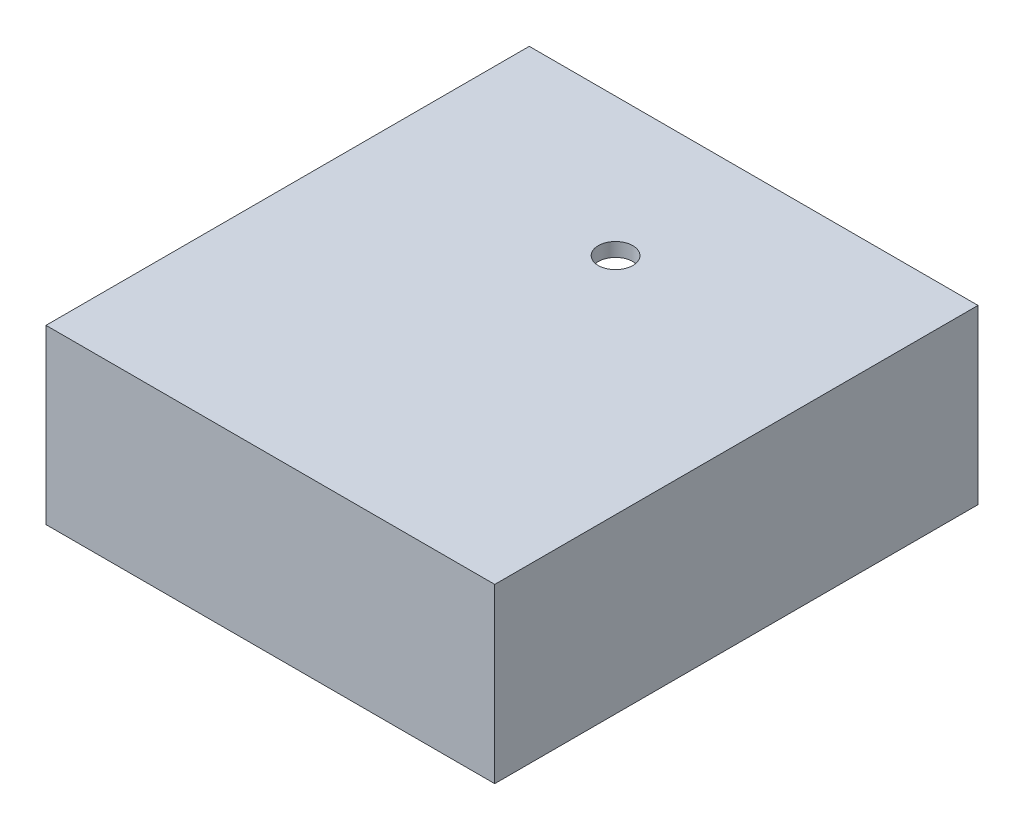
ISO-10303-21;
HEADER;
FILE_DESCRIPTION(('STEP AP214'),'2;1');
FILE_NAME('part.step','',(''),(''),'','','');
FILE_SCHEMA(('AUTOMOTIVE_DESIGN { 1 0 10303 214 1 1 1 1 }'));
ENDSEC;
DATA;
#1=APPLICATION_CONTEXT('core data for automotive mechanical design processes');
#2=APPLICATION_PROTOCOL_DEFINITION('international standard','automotive_design',2000,#1);
#3=PRODUCT_CONTEXT('',#1,'mechanical');
#4=PRODUCT('Part','Part','',(#3));
#5=PRODUCT_RELATED_PRODUCT_CATEGORY('part','',(#4));
#6=PRODUCT_DEFINITION_FORMATION('','',#4);
#7=PRODUCT_DEFINITION_CONTEXT('part definition',#1,'design');
#8=PRODUCT_DEFINITION('design','',#6,#7);
#9=PRODUCT_DEFINITION_SHAPE('','',#8);
#10=(LENGTH_UNIT() NAMED_UNIT(*) SI_UNIT(.MILLI.,.METRE.));
#11=(NAMED_UNIT(*) PLANE_ANGLE_UNIT() SI_UNIT($,.RADIAN.));
#12=(NAMED_UNIT(*) SI_UNIT($,.STERADIAN.) SOLID_ANGLE_UNIT());
#13=UNCERTAINTY_MEASURE_WITH_UNIT(LENGTH_MEASURE(1.E-05),#10,'distance_accuracy_value','');
#14=(GEOMETRIC_REPRESENTATION_CONTEXT(3) GLOBAL_UNCERTAINTY_ASSIGNED_CONTEXT((#13)) GLOBAL_UNIT_ASSIGNED_CONTEXT((#10,
#11,#12)) REPRESENTATION_CONTEXT('',''));
#15=CARTESIAN_POINT('',(0.,0.,0.));
#16=DIRECTION('',(0.,0.,1.));
#17=DIRECTION('',(1.,0.,0.));
#18=AXIS2_PLACEMENT_3D('',#15,#16,#17);
#19=CARTESIAN_POINT('',(0.,25.,0.));
#20=DIRECTION('',(1.,0.,0.));
#21=DIRECTION('',(0.,0.,-1.));
#22=AXIS2_PLACEMENT_3D('',#19,#20,#21);
#23=PLANE('',#22);
#24=DIRECTION('',(0.,0.,1.));
#25=VECTOR('',#24,1.);
#26=CARTESIAN_POINT('',(0.,0.,0.));
#27=LINE('',#26,#25);
#28=CARTESIAN_POINT('',(0.,0.,0.));
#29=VERTEX_POINT('',#28);
#30=CARTESIAN_POINT('',(0.,0.,70.));
#31=VERTEX_POINT('',#30);
#32=EDGE_CURVE('E144',#29,#31,#27,.T.);
#33=ORIENTED_EDGE('',*,*,#32,.T.);
#34=DIRECTION('',(0.,-1.,0.));
#35=VECTOR('',#34,1.);
#36=CARTESIAN_POINT('',(0.,25.,70.));
#37=LINE('',#36,#35);
#38=CARTESIAN_POINT('',(0.,25.,70.));
#39=VERTEX_POINT('',#38);
#40=EDGE_CURVE('E11',#39,#31,#37,.T.);
#41=ORIENTED_EDGE('',*,*,#40,.F.);
#42=DIRECTION('',(0.,0.,1.));
#43=VECTOR('',#42,1.);
#44=CARTESIAN_POINT('',(0.,25.,0.));
#45=LINE('',#44,#43);
#46=CARTESIAN_POINT('',(0.,25.,0.));
#47=VERTEX_POINT('',#46);
#48=EDGE_CURVE('E148',#47,#39,#45,.T.);
#49=ORIENTED_EDGE('',*,*,#48,.F.);
#50=DIRECTION('',(0.,-1.,0.));
#51=VECTOR('',#50,1.);
#52=CARTESIAN_POINT('',(0.,25.,0.));
#53=LINE('',#52,#51);
#54=EDGE_CURVE('E154',#47,#29,#53,.T.);
#55=ORIENTED_EDGE('',*,*,#54,.T.);
#56=EDGE_LOOP('',(#33,#41,#49,#55));
#57=FACE_BOUND('',#56,.T.);
#58=ADVANCED_FACE('F32',(#57),#23,.F.);
#59=CARTESIAN_POINT('',(0.,25.,70.));
#60=DIRECTION('',(0.,0.,-1.));
#61=DIRECTION('',(-1.,0.,0.));
#62=AXIS2_PLACEMENT_3D('',#59,#60,#61);
#63=PLANE('',#62);
#64=DIRECTION('',(1.,0.,0.));
#65=VECTOR('',#64,1.);
#66=CARTESIAN_POINT('',(0.,0.,70.));
#67=LINE('',#66,#65);
#68=CARTESIAN_POINT('',(65.,0.,70.));
#69=VERTEX_POINT('',#68);
#70=EDGE_CURVE('E157',#31,#69,#67,.T.);
#71=ORIENTED_EDGE('',*,*,#70,.T.);
#72=DIRECTION('',(0.,-1.,0.));
#73=VECTOR('',#72,1.);
#74=CARTESIAN_POINT('',(65.,25.,70.));
#75=LINE('',#74,#73);
#76=CARTESIAN_POINT('',(65.,25.,70.));
#77=VERTEX_POINT('',#76);
#78=EDGE_CURVE('E40',#77,#69,#75,.T.);
#79=ORIENTED_EDGE('',*,*,#78,.F.);
#80=DIRECTION('',(1.,0.,0.));
#81=VECTOR('',#80,1.);
#82=CARTESIAN_POINT('',(0.,25.,70.));
#83=LINE('',#82,#81);
#84=EDGE_CURVE('E84',#39,#77,#83,.T.);
#85=ORIENTED_EDGE('',*,*,#84,.F.);
#86=ORIENTED_EDGE('',*,*,#40,.T.);
#87=EDGE_LOOP('',(#71,#79,#85,#86));
#88=FACE_BOUND('',#87,.T.);
#89=ADVANCED_FACE('F188',(#88),#63,.F.);
#90=CARTESIAN_POINT('',(65.,25.,0.));
#91=DIRECTION('',(-1.,0.,0.));
#92=DIRECTION('',(0.,0.,1.));
#93=AXIS2_PLACEMENT_3D('',#90,#91,#92);
#94=PLANE('',#93);
#95=DIRECTION('',(0.,0.,-1.));
#96=VECTOR('',#95,1.);
#97=CARTESIAN_POINT('',(65.,0.,0.));
#98=LINE('',#97,#96);
#99=CARTESIAN_POINT('',(65.,0.,0.));
#100=VERTEX_POINT('',#99);
#101=EDGE_CURVE('E159',#69,#100,#98,.T.);
#102=ORIENTED_EDGE('',*,*,#101,.T.);
#103=DIRECTION('',(0.,-1.,0.));
#104=VECTOR('',#103,1.);
#105=CARTESIAN_POINT('',(65.,25.,0.));
#106=LINE('',#105,#104);
#107=CARTESIAN_POINT('',(65.,25.,0.));
#108=VERTEX_POINT('',#107);
#109=EDGE_CURVE('E163',#108,#100,#106,.T.);
#110=ORIENTED_EDGE('',*,*,#109,.F.);
#111=DIRECTION('',(0.,0.,-1.));
#112=VECTOR('',#111,1.);
#113=CARTESIAN_POINT('',(65.,25.,0.));
#114=LINE('',#113,#112);
#115=EDGE_CURVE('E151',#77,#108,#114,.T.);
#116=ORIENTED_EDGE('',*,*,#115,.F.);
#117=ORIENTED_EDGE('',*,*,#78,.T.);
#118=EDGE_LOOP('',(#102,#110,#116,#117));
#119=FACE_BOUND('',#118,.T.);
#120=ADVANCED_FACE('F169',(#119),#94,.F.);
#121=CARTESIAN_POINT('',(0.,25.,0.));
#122=DIRECTION('',(0.,0.,1.));
#123=DIRECTION('',(1.,0.,0.));
#124=AXIS2_PLACEMENT_3D('',#121,#122,#123);
#125=PLANE('',#124);
#126=DIRECTION('',(1.,0.,0.));
#127=VECTOR('',#126,1.);
#128=CARTESIAN_POINT('',(63.,23.,0.));
#129=LINE('',#128,#127);
#130=CARTESIAN_POINT('',(1.99999999999999,23.,0.));
#131=VERTEX_POINT('',#130);
#132=CARTESIAN_POINT('',(63.,23.,0.));
#133=VERTEX_POINT('',#132);
#134=EDGE_CURVE('E138',#131,#133,#129,.T.);
#135=ORIENTED_EDGE('',*,*,#134,.F.);
#136=DIRECTION('',(0.,1.,0.));
#137=VECTOR('',#136,1.);
#138=CARTESIAN_POINT('',(1.99999999999999,1.99999999999999,0.));
#139=LINE('',#138,#137);
#140=CARTESIAN_POINT('',(1.99999999999999,1.99999999999999,0.));
#141=VERTEX_POINT('',#140);
#142=EDGE_CURVE('E47',#141,#131,#139,.T.);
#143=ORIENTED_EDGE('',*,*,#142,.F.);
#144=DIRECTION('',(-1.,0.,0.));
#145=VECTOR('',#144,1.);
#146=CARTESIAN_POINT('',(63.,1.99999999999999,0.));
#147=LINE('',#146,#145);
#148=CARTESIAN_POINT('',(63.,1.99999999999999,0.));
#149=VERTEX_POINT('',#148);
#150=EDGE_CURVE('E126',#149,#141,#147,.T.);
#151=ORIENTED_EDGE('',*,*,#150,.F.);
#152=DIRECTION('',(0.,-1.,0.));
#153=VECTOR('',#152,1.);
#154=CARTESIAN_POINT('',(63.,1.99999999999999,0.));
#155=LINE('',#154,#153);
#156=EDGE_CURVE('E129',#133,#149,#155,.T.);
#157=ORIENTED_EDGE('',*,*,#156,.F.);
#158=EDGE_LOOP('',(#135,#143,#151,#157));
#159=FACE_BOUND('',#158,.T.);
#160=DIRECTION('',(-1.,0.,0.));
#161=VECTOR('',#160,1.);
#162=CARTESIAN_POINT('',(0.,0.,0.));
#163=LINE('',#162,#161);
#164=EDGE_CURVE('E77',#100,#29,#163,.T.);
#165=ORIENTED_EDGE('',*,*,#164,.T.);
#166=ORIENTED_EDGE('',*,*,#54,.F.);
#167=DIRECTION('',(-1.,0.,0.));
#168=VECTOR('',#167,1.);
#169=CARTESIAN_POINT('',(0.,25.,0.));
#170=LINE('',#169,#168);
#171=EDGE_CURVE('E56',#108,#47,#170,.T.);
#172=ORIENTED_EDGE('',*,*,#171,.F.);
#173=ORIENTED_EDGE('',*,*,#109,.T.);
#174=EDGE_LOOP('',(#165,#166,#172,#173));
#175=FACE_BOUND('',#174,.T.);
#176=ADVANCED_FACE('F177',(#159,#175),#125,.F.);
#177=CARTESIAN_POINT('',(0.,25.,0.));
#178=DIRECTION('',(0.,1.,0.));
#179=DIRECTION('',(0.,0.,1.));
#180=AXIS2_PLACEMENT_3D('',#177,#178,#179);
#181=PLANE('',#180);
#182=CARTESIAN_POINT('',(32.5,25.,20.));
#183=DIRECTION('',(0.,1.,0.));
#184=DIRECTION('',(0.,0.,1.));
#185=AXIS2_PLACEMENT_3D('',#182,#183,#184);
#186=CIRCLE('',#185,2.5);
#187=CARTESIAN_POINT('',(32.5,25.,22.5));
#188=VERTEX_POINT('',#187);
#189=EDGE_CURVE('E294',#188,#188,#186,.T.);
#190=ORIENTED_EDGE('',*,*,#189,.F.);
#191=EDGE_LOOP('',(#190));
#192=FACE_BOUND('',#191,.T.);
#193=ORIENTED_EDGE('',*,*,#48,.T.);
#194=ORIENTED_EDGE('',*,*,#84,.T.);
#195=ORIENTED_EDGE('',*,*,#115,.T.);
#196=ORIENTED_EDGE('',*,*,#171,.T.);
#197=EDGE_LOOP('',(#193,#194,#195,#196));
#198=FACE_BOUND('',#197,.T.);
#199=ADVANCED_FACE('F179',(#192,#198),#181,.T.);
#200=CARTESIAN_POINT('',(0.,0.,0.));
#201=DIRECTION('',(0.,1.,0.));
#202=DIRECTION('',(0.,0.,1.));
#203=AXIS2_PLACEMENT_3D('',#200,#201,#202);
#204=PLANE('',#203);
#205=CARTESIAN_POINT('',(32.5,0.,20.));
#206=DIRECTION('',(0.,1.,0.));
#207=DIRECTION('',(0.,0.,1.));
#208=AXIS2_PLACEMENT_3D('',#205,#206,#207);
#209=CIRCLE('',#208,2.5);
#210=CARTESIAN_POINT('',(32.5,0.,22.5));
#211=VERTEX_POINT('',#210);
#212=EDGE_CURVE('E132',#211,#211,#209,.T.);
#213=ORIENTED_EDGE('',*,*,#212,.T.);
#214=EDGE_LOOP('',(#213));
#215=FACE_BOUND('',#214,.T.);
#216=ORIENTED_EDGE('',*,*,#32,.F.);
#217=ORIENTED_EDGE('',*,*,#164,.F.);
#218=ORIENTED_EDGE('',*,*,#101,.F.);
#219=ORIENTED_EDGE('',*,*,#70,.F.);
#220=EDGE_LOOP('',(#216,#217,#218,#219));
#221=FACE_BOUND('',#220,.T.);
#222=ADVANCED_FACE('F173',(#215,#221),#204,.F.);
#223=CARTESIAN_POINT('',(1.99999999999999,1.99999999999999,40.));
#224=DIRECTION('',(-1.,0.,0.));
#225=DIRECTION('',(0.,0.,1.));
#226=AXIS2_PLACEMENT_3D('',#223,#224,#225);
#227=PLANE('',#226);
#228=ORIENTED_EDGE('',*,*,#142,.T.);
#229=DIRECTION('',(0.,0.,-1.));
#230=VECTOR('',#229,1.);
#231=CARTESIAN_POINT('',(1.99999999999999,23.,40.));
#232=LINE('',#231,#230);
#233=CARTESIAN_POINT('',(1.99999999999999,23.,40.));
#234=VERTEX_POINT('',#233);
#235=EDGE_CURVE('E104',#234,#131,#232,.T.);
#236=ORIENTED_EDGE('',*,*,#235,.F.);
#237=DIRECTION('',(0.,1.,0.));
#238=VECTOR('',#237,1.);
#239=CARTESIAN_POINT('',(1.99999999999999,1.99999999999999,40.));
#240=LINE('',#239,#238);
#241=CARTESIAN_POINT('',(1.99999999999999,1.99999999999999,40.));
#242=VERTEX_POINT('',#241);
#243=EDGE_CURVE('E108',#242,#234,#240,.T.);
#244=ORIENTED_EDGE('',*,*,#243,.F.);
#245=DIRECTION('',(0.,0.,-1.));
#246=VECTOR('',#245,1.);
#247=CARTESIAN_POINT('',(1.99999999999999,1.99999999999999,40.));
#248=LINE('',#247,#246);
#249=EDGE_CURVE('E142',#242,#141,#248,.T.);
#250=ORIENTED_EDGE('',*,*,#249,.T.);
#251=EDGE_LOOP('',(#228,#236,#244,#250));
#252=FACE_BOUND('',#251,.T.);
#253=ADVANCED_FACE('F106',(#252),#227,.F.);
#254=CARTESIAN_POINT('',(63.,1.99999999999999,40.));
#255=DIRECTION('',(0.,-1.,0.));
#256=DIRECTION('',(0.,0.,-1.));
#257=AXIS2_PLACEMENT_3D('',#254,#255,#256);
#258=PLANE('',#257);
#259=CARTESIAN_POINT('',(32.5,1.99999999999999,20.));
#260=DIRECTION('',(0.,-1.,0.));
#261=DIRECTION('',(0.,0.,-1.));
#262=AXIS2_PLACEMENT_3D('',#259,#260,#261);
#263=CIRCLE('',#262,2.5);
#264=CARTESIAN_POINT('',(32.5,1.99999999999999,17.5));
#265=VERTEX_POINT('',#264);
#266=EDGE_CURVE('E290',#265,#265,#263,.T.);
#267=ORIENTED_EDGE('',*,*,#266,.T.);
#268=EDGE_LOOP('',(#267));
#269=FACE_BOUND('',#268,.T.);
#270=ORIENTED_EDGE('',*,*,#150,.T.);
#271=ORIENTED_EDGE('',*,*,#249,.F.);
#272=DIRECTION('',(-1.,0.,0.));
#273=VECTOR('',#272,1.);
#274=CARTESIAN_POINT('',(63.,1.99999999999999,40.));
#275=LINE('',#274,#273);
#276=CARTESIAN_POINT('',(63.,1.99999999999999,40.));
#277=VERTEX_POINT('',#276);
#278=EDGE_CURVE('E114',#277,#242,#275,.T.);
#279=ORIENTED_EDGE('',*,*,#278,.F.);
#280=DIRECTION('',(0.,0.,-1.));
#281=VECTOR('',#280,1.);
#282=CARTESIAN_POINT('',(63.,1.99999999999999,40.));
#283=LINE('',#282,#281);
#284=EDGE_CURVE('E145',#277,#149,#283,.T.);
#285=ORIENTED_EDGE('',*,*,#284,.T.);
#286=EDGE_LOOP('',(#270,#271,#279,#285));
#287=FACE_BOUND('',#286,.T.);
#288=ADVANCED_FACE('F215',(#269,#287),#258,.F.);
#289=CARTESIAN_POINT('',(63.,1.99999999999999,40.));
#290=DIRECTION('',(1.,0.,0.));
#291=DIRECTION('',(0.,0.,-1.));
#292=AXIS2_PLACEMENT_3D('',#289,#290,#291);
#293=PLANE('',#292);
#294=ORIENTED_EDGE('',*,*,#156,.T.);
#295=ORIENTED_EDGE('',*,*,#284,.F.);
#296=DIRECTION('',(0.,-1.,0.));
#297=VECTOR('',#296,1.);
#298=CARTESIAN_POINT('',(63.,1.99999999999999,40.));
#299=LINE('',#298,#297);
#300=CARTESIAN_POINT('',(63.,23.,40.));
#301=VERTEX_POINT('',#300);
#302=EDGE_CURVE('E122',#301,#277,#299,.T.);
#303=ORIENTED_EDGE('',*,*,#302,.F.);
#304=DIRECTION('',(0.,0.,-1.));
#305=VECTOR('',#304,1.);
#306=CARTESIAN_POINT('',(63.,23.,40.));
#307=LINE('',#306,#305);
#308=EDGE_CURVE('E113',#301,#133,#307,.T.);
#309=ORIENTED_EDGE('',*,*,#308,.T.);
#310=EDGE_LOOP('',(#294,#295,#303,#309));
#311=FACE_BOUND('',#310,.T.);
#312=ADVANCED_FACE('F224',(#311),#293,.F.);
#313=CARTESIAN_POINT('',(63.,23.,40.));
#314=DIRECTION('',(0.,1.,0.));
#315=DIRECTION('',(0.,0.,1.));
#316=AXIS2_PLACEMENT_3D('',#313,#314,#315);
#317=PLANE('',#316);
#318=CARTESIAN_POINT('',(32.5,23.,20.));
#319=DIRECTION('',(0.,1.,0.));
#320=DIRECTION('',(0.,0.,1.));
#321=AXIS2_PLACEMENT_3D('',#318,#319,#320);
#322=CIRCLE('',#321,2.5);
#323=CARTESIAN_POINT('',(32.5,23.,22.5));
#324=VERTEX_POINT('',#323);
#325=EDGE_CURVE('E35',#324,#324,#322,.T.);
#326=ORIENTED_EDGE('',*,*,#325,.T.);
#327=EDGE_LOOP('',(#326));
#328=FACE_BOUND('',#327,.T.);
#329=ORIENTED_EDGE('',*,*,#134,.T.);
#330=ORIENTED_EDGE('',*,*,#308,.F.);
#331=DIRECTION('',(1.,0.,0.));
#332=VECTOR('',#331,1.);
#333=CARTESIAN_POINT('',(63.,23.,40.));
#334=LINE('',#333,#332);
#335=EDGE_CURVE('E117',#234,#301,#334,.T.);
#336=ORIENTED_EDGE('',*,*,#335,.F.);
#337=ORIENTED_EDGE('',*,*,#235,.T.);
#338=EDGE_LOOP('',(#329,#330,#336,#337));
#339=FACE_BOUND('',#338,.T.);
#340=ADVANCED_FACE('F118',(#328,#339),#317,.F.);
#341=CARTESIAN_POINT('',(0.,0.,40.));
#342=DIRECTION('',(0.,0.,1.));
#343=DIRECTION('',(1.,0.,0.));
#344=AXIS2_PLACEMENT_3D('',#341,#342,#343);
#345=PLANE('',#344);
#346=ORIENTED_EDGE('',*,*,#243,.T.);
#347=ORIENTED_EDGE('',*,*,#335,.T.);
#348=ORIENTED_EDGE('',*,*,#302,.T.);
#349=ORIENTED_EDGE('',*,*,#278,.T.);
#350=EDGE_LOOP('',(#346,#347,#348,#349));
#351=FACE_BOUND('',#350,.T.);
#352=ADVANCED_FACE('F124',(#351),#345,.F.);
#353=CARTESIAN_POINT('',(32.5,-5.,20.));
#354=DIRECTION('',(0.,1.,0.));
#355=DIRECTION('',(0.,0.,1.));
#356=AXIS2_PLACEMENT_3D('',#353,#354,#355);
#357=CYLINDRICAL_SURFACE('',#356,2.5);
#358=ORIENTED_EDGE('',*,*,#189,.T.);
#359=EDGE_LOOP('',(#358));
#360=FACE_BOUND('',#359,.T.);
#361=ORIENTED_EDGE('',*,*,#325,.F.);
#362=EDGE_LOOP('',(#361));
#363=FACE_BOUND('',#362,.T.);
#364=ADVANCED_FACE('F240',(#360,#363),#357,.F.);
#365=ORIENTED_EDGE('',*,*,#266,.F.);
#366=EDGE_LOOP('',(#365));
#367=FACE_BOUND('',#366,.T.);
#368=ORIENTED_EDGE('',*,*,#212,.F.);
#369=EDGE_LOOP('',(#368));
#370=FACE_BOUND('',#369,.T.);
#371=ADVANCED_FACE('F274',(#367,#370),#357,.F.);
#372=CLOSED_SHELL('',(#58,#89,#120,#176,#199,#222,#253,#288,#312,#340,#352,#364,#371));
#373=MANIFOLD_SOLID_BREP('B2',#372);
#374=ADVANCED_BREP_SHAPE_REPRESENTATION('',(#18,#373),#14);
#375=SHAPE_DEFINITION_REPRESENTATION(#9,#374);
ENDSEC;
END-ISO-10303-21;
